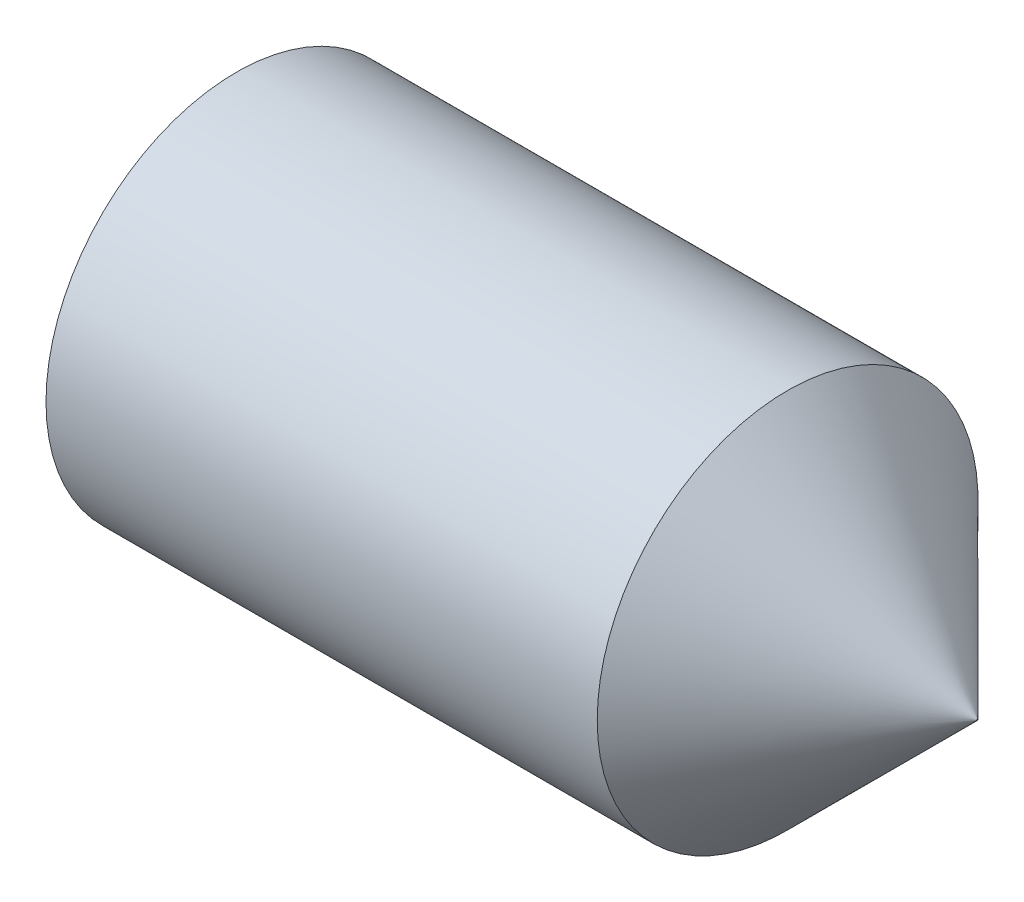
ISO-10303-21;
HEADER;
FILE_DESCRIPTION(('STEP AP214'),'2;1');
FILE_NAME('part.step','',(''),(''),'','','');
FILE_SCHEMA(('AUTOMOTIVE_DESIGN { 1 0 10303 214 1 1 1 1 }'));
ENDSEC;
DATA;
#1=APPLICATION_CONTEXT('core data for automotive mechanical design processes');
#2=APPLICATION_PROTOCOL_DEFINITION('international standard','automotive_design',2000,#1);
#3=PRODUCT_CONTEXT('',#1,'mechanical');
#4=PRODUCT('Part','Part','',(#3));
#5=PRODUCT_RELATED_PRODUCT_CATEGORY('part','',(#4));
#6=PRODUCT_DEFINITION_FORMATION('','',#4);
#7=PRODUCT_DEFINITION_CONTEXT('part definition',#1,'design');
#8=PRODUCT_DEFINITION('design','',#6,#7);
#9=PRODUCT_DEFINITION_SHAPE('','',#8);
#10=(LENGTH_UNIT() NAMED_UNIT(*) SI_UNIT(.MILLI.,.METRE.));
#11=(NAMED_UNIT(*) PLANE_ANGLE_UNIT() SI_UNIT($,.RADIAN.));
#12=(NAMED_UNIT(*) SI_UNIT($,.STERADIAN.) SOLID_ANGLE_UNIT());
#13=UNCERTAINTY_MEASURE_WITH_UNIT(LENGTH_MEASURE(1.E-05),#10,'distance_accuracy_value','');
#14=(GEOMETRIC_REPRESENTATION_CONTEXT(3) GLOBAL_UNCERTAINTY_ASSIGNED_CONTEXT((#13)) GLOBAL_UNIT_ASSIGNED_CONTEXT((#10,
#11,#12)) REPRESENTATION_CONTEXT('',''));
#15=CARTESIAN_POINT('',(0.,0.,0.));
#16=DIRECTION('',(0.,0.,1.));
#17=DIRECTION('',(1.,0.,0.));
#18=AXIS2_PLACEMENT_3D('',#15,#16,#17);
#19=CARTESIAN_POINT('',(0.,0.,0.));
#20=DIRECTION('',(-1.,0.,0.));
#21=DIRECTION('',(0.,0.,1.));
#22=AXIS2_PLACEMENT_3D('',#19,#20,#21);
#23=PLANE('',#22);
#24=CARTESIAN_POINT('',(0.,0.,0.));
#25=DIRECTION('',(-1.,0.,0.));
#26=DIRECTION('',(0.,0.,1.));
#27=AXIS2_PLACEMENT_3D('',#24,#25,#26);
#28=CIRCLE('',#27,1.2195);
#29=CARTESIAN_POINT('',(0.,0.,1.2195));
#30=VERTEX_POINT('',#29);
#31=EDGE_CURVE('E11',#30,#30,#28,.T.);
#32=ORIENTED_EDGE('',*,*,#31,.T.);
#33=EDGE_LOOP('',(#32));
#34=FACE_BOUND('',#33,.T.);
#35=DIRECTION('',(0.,0.,-1.));
#36=VECTOR('',#35,1.);
#37=CARTESIAN_POINT('',(0.,0.750000000000003,0.433012701892217));
#38=LINE('',#37,#36);
#39=CARTESIAN_POINT('',(0.,0.750000000000003,0.433012701892217));
#40=VERTEX_POINT('',#39);
#41=CARTESIAN_POINT('',(0.,0.750000000000003,-0.433012701892222));
#42=VERTEX_POINT('',#41);
#43=EDGE_CURVE('E126',#40,#42,#38,.T.);
#44=ORIENTED_EDGE('',*,*,#43,.F.);
#45=DIRECTION('',(0.,-0.866025403784439,0.5));
#46=VECTOR('',#45,1.);
#47=CARTESIAN_POINT('',(0.,0.750000000000003,0.433012701892217));
#48=LINE('',#47,#46);
#49=CARTESIAN_POINT('',(0.,0.,0.866025403784436));
#50=VERTEX_POINT('',#49);
#51=EDGE_CURVE('E48',#40,#50,#48,.T.);
#52=ORIENTED_EDGE('',*,*,#51,.T.);
#53=DIRECTION('',(0.,0.866025403784439,0.5));
#54=VECTOR('',#53,1.);
#55=CARTESIAN_POINT('',(0.,-0.749999999999997,0.433012701892217));
#56=LINE('',#55,#54);
#57=CARTESIAN_POINT('',(0.,-0.749999999999997,0.433012701892217));
#58=VERTEX_POINT('',#57);
#59=EDGE_CURVE('E117',#58,#50,#56,.T.);
#60=ORIENTED_EDGE('',*,*,#59,.F.);
#61=DIRECTION('',(0.,0.,-1.));
#62=VECTOR('',#61,1.);
#63=CARTESIAN_POINT('',(0.,-0.749999999999997,0.433012701892217));
#64=LINE('',#63,#62);
#65=CARTESIAN_POINT('',(0.,-0.749999999999997,-0.433012701892222));
#66=VERTEX_POINT('',#65);
#67=EDGE_CURVE('E120',#58,#66,#64,.T.);
#68=ORIENTED_EDGE('',*,*,#67,.T.);
#69=DIRECTION('',(0.,0.866025403784438,-0.5));
#70=VECTOR('',#69,1.);
#71=CARTESIAN_POINT('',(0.,-0.749999999999997,-0.433012701892222));
#72=LINE('',#71,#70);
#73=CARTESIAN_POINT('',(0.,0.,-0.866025403784442));
#74=VERTEX_POINT('',#73);
#75=EDGE_CURVE('E123',#66,#74,#72,.T.);
#76=ORIENTED_EDGE('',*,*,#75,.T.);
#77=DIRECTION('',(0.,-0.866025403784439,-0.5));
#78=VECTOR('',#77,1.);
#79=CARTESIAN_POINT('',(0.,0.750000000000003,-0.433012701892222));
#80=LINE('',#79,#78);
#81=EDGE_CURVE('E106',#42,#74,#80,.T.);
#82=ORIENTED_EDGE('',*,*,#81,.F.);
#83=EDGE_LOOP('',(#44,#52,#60,#68,#76,#82));
#84=FACE_BOUND('',#83,.T.);
#85=ADVANCED_FACE('F34',(#34,#84),#23,.T.);
#86=CARTESIAN_POINT('',(0.,0.,0.));
#87=DIRECTION('',(1.,0.,0.));
#88=DIRECTION('',(0.,0.,-1.));
#89=AXIS2_PLACEMENT_3D('',#86,#87,#88);
#90=CONICAL_SURFACE('',#89,1.2195,1.0471975511966);
#91=CARTESIAN_POINT('',(0.161946750507689,0.,0.));
#92=DIRECTION('',(-1.,0.,0.));
#93=DIRECTION('',(0.,0.,1.));
#94=AXIS2_PLACEMENT_3D('',#91,#92,#93);
#95=CIRCLE('',#94,1.5);
#96=CARTESIAN_POINT('',(0.161946750507689,0.,1.5));
#97=VERTEX_POINT('',#96);
#98=EDGE_CURVE('E41',#97,#97,#95,.T.);
#99=ORIENTED_EDGE('',*,*,#98,.T.);
#100=EDGE_LOOP('',(#99));
#101=FACE_BOUND('',#100,.T.);
#102=ORIENTED_EDGE('',*,*,#31,.F.);
#103=EDGE_LOOP('',(#102));
#104=FACE_BOUND('',#103,.T.);
#105=ADVANCED_FACE('F143',(#101,#104),#90,.T.);
#106=CARTESIAN_POINT('',(-12.7,0.,0.));
#107=DIRECTION('',(-1.,0.,0.));
#108=DIRECTION('',(0.,0.,1.));
#109=AXIS2_PLACEMENT_3D('',#106,#107,#108);
#110=CYLINDRICAL_SURFACE('',#109,1.5);
#111=CARTESIAN_POINT('',(4.50500000000001,0.,0.));
#112=DIRECTION('',(-1.,0.,0.));
#113=DIRECTION('',(0.,0.,1.));
#114=AXIS2_PLACEMENT_3D('',#111,#112,#113);
#115=CIRCLE('',#114,1.5);
#116=CARTESIAN_POINT('',(4.50500000000001,0.,1.5));
#117=VERTEX_POINT('',#116);
#118=EDGE_CURVE('E138',#117,#117,#115,.T.);
#119=ORIENTED_EDGE('',*,*,#118,.T.);
#120=EDGE_LOOP('',(#119));
#121=FACE_BOUND('',#120,.T.);
#122=ORIENTED_EDGE('',*,*,#98,.F.);
#123=EDGE_LOOP('',(#122));
#124=FACE_BOUND('',#123,.T.);
#125=ADVANCED_FACE('F146',(#121,#124),#110,.T.);
#126=CARTESIAN_POINT('',(6.,0.,0.));
#127=DIRECTION('',(-1.,0.,0.));
#128=DIRECTION('',(0.,0.,1.));
#129=AXIS2_PLACEMENT_3D('',#126,#127,#128);
#130=CONICAL_SURFACE('',#129,0.0049999999999998,0.785398163397451);
#131=CARTESIAN_POINT('',(6.,0.,0.));
#132=DIRECTION('',(-1.,0.,0.));
#133=DIRECTION('',(0.,0.,1.));
#134=AXIS2_PLACEMENT_3D('',#131,#132,#133);
#135=CIRCLE('',#134,0.0049999999999998);
#136=CARTESIAN_POINT('',(6.,0.,0.00499999999999936));
#137=VERTEX_POINT('',#136);
#138=EDGE_CURVE('E135',#137,#137,#135,.T.);
#139=CARTESIAN_POINT('',(4.50500000000001,0.,1.5));
#140=CARTESIAN_POINT('',(4.52057291666667,0.,1.48442708333333));
#141=CARTESIAN_POINT('',(4.53614583333334,0.,1.46885416666667));
#142=CARTESIAN_POINT('',(4.56729166666667,0.,1.43770833333333));
#143=CARTESIAN_POINT('',(4.58286458333334,0.,1.42213541666667));
#144=CARTESIAN_POINT('',(4.61401041666667,0.,1.39098958333333));
#145=CARTESIAN_POINT('',(4.62958333333334,0.,1.37541666666667));
#146=CARTESIAN_POINT('',(4.66072916666667,0.,1.34427083333333));
#147=CARTESIAN_POINT('',(4.67630208333334,0.,1.32869791666667));
#148=CARTESIAN_POINT('',(4.70744791666667,0.,1.29755208333333));
#149=CARTESIAN_POINT('',(4.72302083333334,0.,1.28197916666667));
#150=CARTESIAN_POINT('',(4.75416666666667,0.,1.25083333333333));
#151=CARTESIAN_POINT('',(4.76973958333334,0.,1.23526041666667));
#152=CARTESIAN_POINT('',(4.80088541666667,0.,1.20411458333333));
#153=CARTESIAN_POINT('',(4.81645833333334,0.,1.18854166666667));
#154=CARTESIAN_POINT('',(4.84760416666667,0.,1.15739583333333));
#155=CARTESIAN_POINT('',(4.86317708333334,0.,1.14182291666667));
#156=CARTESIAN_POINT('',(4.89432291666667,0.,1.11067708333333));
#157=CARTESIAN_POINT('',(4.90989583333334,0.,1.09510416666667));
#158=CARTESIAN_POINT('',(4.94104166666667,0.,1.06395833333333));
#159=CARTESIAN_POINT('',(4.95661458333334,0.,1.04838541666667));
#160=CARTESIAN_POINT('',(4.98776041666667,0.,1.01723958333333));
#161=CARTESIAN_POINT('',(5.00333333333334,0.,1.00166666666667));
#162=CARTESIAN_POINT('',(5.03447916666667,0.,0.970520833333333));
#163=CARTESIAN_POINT('',(5.05005208333334,0.,0.954947916666666));
#164=CARTESIAN_POINT('',(5.08119791666667,0.,0.923802083333333));
#165=CARTESIAN_POINT('',(5.09677083333334,0.,0.908229166666666));
#166=CARTESIAN_POINT('',(5.12791666666667,0.,0.877083333333333));
#167=CARTESIAN_POINT('',(5.14348958333334,0.,0.861510416666666));
#168=CARTESIAN_POINT('',(5.17463541666667,0.,0.830364583333333));
#169=CARTESIAN_POINT('',(5.19020833333334,0.,0.814791666666666));
#170=CARTESIAN_POINT('',(5.22135416666667,0.,0.783645833333333));
#171=CARTESIAN_POINT('',(5.23692708333334,0.,0.768072916666666));
#172=CARTESIAN_POINT('',(5.26807291666667,0.,0.736927083333332));
#173=CARTESIAN_POINT('',(5.28364583333334,0.,0.721354166666666));
#174=CARTESIAN_POINT('',(5.31479166666667,0.,0.690208333333333));
#175=CARTESIAN_POINT('',(5.33036458333334,0.,0.674635416666666));
#176=CARTESIAN_POINT('',(5.36151041666667,0.,0.643489583333333));
#177=CARTESIAN_POINT('',(5.37708333333333,0.,0.627916666666666));
#178=CARTESIAN_POINT('',(5.40822916666667,0.,0.596770833333333));
#179=CARTESIAN_POINT('',(5.42380208333334,0.,0.581197916666666));
#180=CARTESIAN_POINT('',(5.45494791666667,0.,0.550052083333333));
#181=CARTESIAN_POINT('',(5.47052083333334,0.,0.534479166666666));
#182=CARTESIAN_POINT('',(5.50166666666667,0.,0.503333333333333));
#183=CARTESIAN_POINT('',(5.51723958333333,0.,0.487760416666666));
#184=CARTESIAN_POINT('',(5.54838541666667,0.,0.456614583333333));
#185=CARTESIAN_POINT('',(5.56395833333333,0.,0.441041666666666));
#186=CARTESIAN_POINT('',(5.59510416666667,0.,0.409895833333333));
#187=CARTESIAN_POINT('',(5.61067708333333,0.,0.394322916666666));
#188=CARTESIAN_POINT('',(5.64182291666667,0.,0.363177083333333));
#189=CARTESIAN_POINT('',(5.65739583333333,0.,0.347604166666666));
#190=CARTESIAN_POINT('',(5.68854166666667,0.,0.316458333333332));
#191=CARTESIAN_POINT('',(5.70411458333333,0.,0.300885416666666));
#192=CARTESIAN_POINT('',(5.73526041666667,0.,0.269739583333333));
#193=CARTESIAN_POINT('',(5.75083333333333,0.,0.254166666666666));
#194=CARTESIAN_POINT('',(5.78197916666667,0.,0.223020833333333));
#195=CARTESIAN_POINT('',(5.79755208333333,0.,0.207447916666666));
#196=CARTESIAN_POINT('',(5.82869791666667,0.,0.176302083333333));
#197=CARTESIAN_POINT('',(5.84427083333333,0.,0.160729166666666));
#198=CARTESIAN_POINT('',(5.87541666666667,0.,0.129583333333333));
#199=CARTESIAN_POINT('',(5.89098958333333,0.,0.114010416666666));
#200=CARTESIAN_POINT('',(5.92213541666667,0.,0.0828645833333327));
#201=CARTESIAN_POINT('',(5.93770833333333,0.,0.0672916666666662));
#202=CARTESIAN_POINT('',(5.96885416666667,0.,0.0361458333333329));
#203=CARTESIAN_POINT('',(5.98442708333333,0.,0.0205729166666662));
#204=CARTESIAN_POINT('',(6.,0.,0.00499999999999936));
#205=B_SPLINE_CURVE_WITH_KNOTS('',3,(#139,#140,#141,#142,#143,#144,#145,#146,#147,#148,#149,
#150,#151,#152,#153,#154,#155,#156,#157,#158,#159,#160,#161,#162,#163,#164,#165,#166,#167,#168,
#169,#170,#171,#172,#173,#174,#175,#176,#177,#178,#179,#180,#181,#182,#183,#184,#185,#186,#187,
#188,#189,#190,#191,#192,#193,#194,#195,#196,#197,#198,#199,#200,#201,#202,#203,#204),
.UNSPECIFIED.,.F.,.F.,(4,2,2,2,2,2,2,2,2,2,2,2,2,2,2,2,2,2,2,2,2,2,2,2,2,2,2,2,2,2,2,2,4),(0.,
0.0660702898671186,0.132140579734236,0.198210869601354,0.264281159468472,0.33035144933559,
0.396421739202708,0.462492029069825,0.528562318936943,0.594632608804061,0.660702898671179,
0.726773188538297,0.792843478405415,0.858913768272533,0.92498405813965,0.991054348006769,
1.05712463787389,1.123194927741,1.18926521760812,1.25533550747524,1.32140579734236,
1.38747608720948,1.45354637707659,1.51961666694371,1.58568695681083,1.65175724667795,
1.71782753654507,1.78389782641218,1.8499681162793,1.91603840614642,1.98210869601354,
2.04817898588065,2.11424927574777),.UNSPECIFIED.);
#206=EDGE_CURVE('BSEAM148',#117,#137,#205,.T.);
#207=ORIENTED_EDGE('',*,*,#118,.F.);
#208=ORIENTED_EDGE('',*,*,#138,.T.);
#209=ORIENTED_EDGE('',*,*,#206,.T.);
#210=ORIENTED_EDGE('',*,*,#206,.F.);
#211=EDGE_LOOP('',(#207,#209,#208,#210));
#212=FACE_BOUND('',#211,.T.);
#213=ADVANCED_FACE('F148',(#212),#130,.T.);
#214=CARTESIAN_POINT('',(6.,0.,0.));
#215=DIRECTION('',(-1.,0.,0.));
#216=DIRECTION('',(0.,0.,1.));
#217=AXIS2_PLACEMENT_3D('',#214,#215,#216);
#218=PLANE('',#217);
#219=ORIENTED_EDGE('',*,*,#138,.F.);
#220=EDGE_LOOP('',(#219));
#221=FACE_BOUND('',#220,.T.);
#222=ADVANCED_FACE('F155',(#221),#218,.F.);
#223=CARTESIAN_POINT('',(2.1,0.750000000000003,0.433012701892217));
#224=DIRECTION('',(0.,-0.5,-0.866025403784439));
#225=DIRECTION('',(0.,0.866025403784439,-0.5));
#226=AXIS2_PLACEMENT_3D('',#223,#224,#225);
#227=PLANE('',#226);
#228=ORIENTED_EDGE('',*,*,#51,.F.);
#229=DIRECTION('',(-1.,0.,0.));
#230=VECTOR('',#229,1.);
#231=CARTESIAN_POINT('',(2.1,0.750000000000003,0.433012701892217));
#232=LINE('',#231,#230);
#233=CARTESIAN_POINT('',(2.1,0.750000000000003,0.433012701892217));
#234=VERTEX_POINT('',#233);
#235=EDGE_CURVE('E53',#234,#40,#232,.T.);
#236=ORIENTED_EDGE('',*,*,#235,.F.);
#237=DIRECTION('',(0.,-0.866025403784439,0.5));
#238=VECTOR('',#237,1.);
#239=CARTESIAN_POINT('',(2.1,0.750000000000003,0.433012701892217));
#240=LINE('',#239,#238);
#241=CARTESIAN_POINT('',(2.1,0.,0.866025403784436));
#242=VERTEX_POINT('',#241);
#243=EDGE_CURVE('E80',#234,#242,#240,.T.);
#244=ORIENTED_EDGE('',*,*,#243,.T.);
#245=DIRECTION('',(-1.,0.,0.));
#246=VECTOR('',#245,1.);
#247=CARTESIAN_POINT('',(2.1,0.,0.866025403784436));
#248=LINE('',#247,#246);
#249=EDGE_CURVE('E133',#242,#50,#248,.T.);
#250=ORIENTED_EDGE('',*,*,#249,.T.);
#251=EDGE_LOOP('',(#228,#236,#244,#250));
#252=FACE_BOUND('',#251,.T.);
#253=ADVANCED_FACE('F186',(#252),#227,.T.);
#254=CARTESIAN_POINT('',(2.1,-0.749999999999997,0.433012701892217));
#255=DIRECTION('',(0.,-0.5,0.866025403784439));
#256=DIRECTION('',(0.,-0.866025403784439,-0.5));
#257=AXIS2_PLACEMENT_3D('',#254,#255,#256);
#258=PLANE('',#257);
#259=ORIENTED_EDGE('',*,*,#59,.T.);
#260=ORIENTED_EDGE('',*,*,#249,.F.);
#261=DIRECTION('',(0.,0.866025403784439,0.5));
#262=VECTOR('',#261,1.);
#263=CARTESIAN_POINT('',(2.1,-0.749999999999997,0.433012701892217));
#264=LINE('',#263,#262);
#265=CARTESIAN_POINT('',(2.1,-0.749999999999997,0.433012701892217));
#266=VERTEX_POINT('',#265);
#267=EDGE_CURVE('E265',#266,#242,#264,.T.);
#268=ORIENTED_EDGE('',*,*,#267,.F.);
#269=DIRECTION('',(-1.,0.,0.));
#270=VECTOR('',#269,1.);
#271=CARTESIAN_POINT('',(2.1,-0.749999999999997,0.433012701892217));
#272=LINE('',#271,#270);
#273=EDGE_CURVE('E131',#266,#58,#272,.T.);
#274=ORIENTED_EDGE('',*,*,#273,.T.);
#275=EDGE_LOOP('',(#259,#260,#268,#274));
#276=FACE_BOUND('',#275,.T.);
#277=ADVANCED_FACE('F182',(#276),#258,.F.);
#278=CARTESIAN_POINT('',(2.1,-0.749999999999997,0.433012701892217));
#279=DIRECTION('',(0.,1.,0.));
#280=DIRECTION('',(0.,0.,1.));
#281=AXIS2_PLACEMENT_3D('',#278,#279,#280);
#282=PLANE('',#281);
#283=ORIENTED_EDGE('',*,*,#67,.F.);
#284=ORIENTED_EDGE('',*,*,#273,.F.);
#285=DIRECTION('',(0.,0.,-1.));
#286=VECTOR('',#285,1.);
#287=CARTESIAN_POINT('',(2.1,-0.749999999999997,0.433012701892217));
#288=LINE('',#287,#286);
#289=CARTESIAN_POINT('',(2.1,-0.749999999999997,-0.433012701892222));
#290=VERTEX_POINT('',#289);
#291=EDGE_CURVE('E101',#266,#290,#288,.T.);
#292=ORIENTED_EDGE('',*,*,#291,.T.);
#293=DIRECTION('',(-1.,0.,0.));
#294=VECTOR('',#293,1.);
#295=CARTESIAN_POINT('',(2.1,-0.749999999999997,-0.433012701892222));
#296=LINE('',#295,#294);
#297=EDGE_CURVE('E96',#290,#66,#296,.T.);
#298=ORIENTED_EDGE('',*,*,#297,.T.);
#299=EDGE_LOOP('',(#283,#284,#292,#298));
#300=FACE_BOUND('',#299,.T.);
#301=ADVANCED_FACE('F179',(#300),#282,.T.);
#302=CARTESIAN_POINT('',(2.1,-0.749999999999997,-0.433012701892222));
#303=DIRECTION('',(0.,0.5,0.866025403784438));
#304=DIRECTION('',(0.,-0.866025403784439,0.5));
#305=AXIS2_PLACEMENT_3D('',#302,#303,#304);
#306=PLANE('',#305);
#307=ORIENTED_EDGE('',*,*,#75,.F.);
#308=ORIENTED_EDGE('',*,*,#297,.F.);
#309=DIRECTION('',(0.,0.866025403784438,-0.5));
#310=VECTOR('',#309,1.);
#311=CARTESIAN_POINT('',(2.1,-0.749999999999997,-0.433012701892222));
#312=LINE('',#311,#310);
#313=CARTESIAN_POINT('',(2.1,0.,-0.866025403784442));
#314=VERTEX_POINT('',#313);
#315=EDGE_CURVE('E91',#290,#314,#312,.T.);
#316=ORIENTED_EDGE('',*,*,#315,.T.);
#317=DIRECTION('',(-1.,0.,0.));
#318=VECTOR('',#317,1.);
#319=CARTESIAN_POINT('',(2.1,0.,-0.866025403784442));
#320=LINE('',#319,#318);
#321=EDGE_CURVE('E95',#314,#74,#320,.T.);
#322=ORIENTED_EDGE('',*,*,#321,.T.);
#323=EDGE_LOOP('',(#307,#308,#316,#322));
#324=FACE_BOUND('',#323,.T.);
#325=ADVANCED_FACE('F94',(#324),#306,.T.);
#326=CARTESIAN_POINT('',(2.1,0.750000000000003,-0.433012701892222));
#327=DIRECTION('',(0.,0.5,-0.866025403784439));
#328=DIRECTION('',(0.,0.866025403784439,0.5));
#329=AXIS2_PLACEMENT_3D('',#326,#327,#328);
#330=PLANE('',#329);
#331=ORIENTED_EDGE('',*,*,#81,.T.);
#332=ORIENTED_EDGE('',*,*,#321,.F.);
#333=DIRECTION('',(0.,-0.866025403784439,-0.5));
#334=VECTOR('',#333,1.);
#335=CARTESIAN_POINT('',(2.1,0.750000000000003,-0.433012701892222));
#336=LINE('',#335,#334);
#337=CARTESIAN_POINT('',(2.1,0.750000000000003,-0.433012701892222));
#338=VERTEX_POINT('',#337);
#339=EDGE_CURVE('E100',#338,#314,#336,.T.);
#340=ORIENTED_EDGE('',*,*,#339,.F.);
#341=DIRECTION('',(-1.,0.,0.));
#342=VECTOR('',#341,1.);
#343=CARTESIAN_POINT('',(2.1,0.750000000000003,-0.433012701892222));
#344=LINE('',#343,#342);
#345=EDGE_CURVE('E76',#338,#42,#344,.T.);
#346=ORIENTED_EDGE('',*,*,#345,.T.);
#347=EDGE_LOOP('',(#331,#332,#340,#346));
#348=FACE_BOUND('',#347,.T.);
#349=ADVANCED_FACE('F103',(#348),#330,.F.);
#350=CARTESIAN_POINT('',(2.1,0.750000000000003,0.433012701892217));
#351=DIRECTION('',(0.,1.,0.));
#352=DIRECTION('',(0.,0.,1.));
#353=AXIS2_PLACEMENT_3D('',#350,#351,#352);
#354=PLANE('',#353);
#355=ORIENTED_EDGE('',*,*,#43,.T.);
#356=ORIENTED_EDGE('',*,*,#345,.F.);
#357=DIRECTION('',(0.,0.,-1.));
#358=VECTOR('',#357,1.);
#359=CARTESIAN_POINT('',(2.1,0.750000000000003,0.433012701892217));
#360=LINE('',#359,#358);
#361=EDGE_CURVE('E111',#234,#338,#360,.T.);
#362=ORIENTED_EDGE('',*,*,#361,.F.);
#363=ORIENTED_EDGE('',*,*,#235,.T.);
#364=EDGE_LOOP('',(#355,#356,#362,#363));
#365=FACE_BOUND('',#364,.T.);
#366=ADVANCED_FACE('F167',(#365),#354,.F.);
#367=CARTESIAN_POINT('',(2.1,-0.749999999999997,1.29903810567666));
#368=DIRECTION('',(1.,0.,0.));
#369=DIRECTION('',(0.,0.,-1.));
#370=AXIS2_PLACEMENT_3D('',#367,#368,#369);
#371=PLANE('',#370);
#372=ORIENTED_EDGE('',*,*,#243,.F.);
#373=ORIENTED_EDGE('',*,*,#361,.T.);
#374=ORIENTED_EDGE('',*,*,#339,.T.);
#375=ORIENTED_EDGE('',*,*,#315,.F.);
#376=ORIENTED_EDGE('',*,*,#291,.F.);
#377=ORIENTED_EDGE('',*,*,#267,.T.);
#378=EDGE_LOOP('',(#372,#373,#374,#375,#376,#377));
#379=FACE_BOUND('',#378,.T.);
#380=ADVANCED_FACE('F109',(#379),#371,.F.);
#381=CLOSED_SHELL('',(#85,#105,#125,#213,#222,#253,#277,#301,#325,#349,#366,#380));
#382=MANIFOLD_SOLID_BREP('B2',#381);
#383=ADVANCED_BREP_SHAPE_REPRESENTATION('',(#18,#382),#14);
#384=SHAPE_DEFINITION_REPRESENTATION(#9,#383);
ENDSEC;
END-ISO-10303-21;
